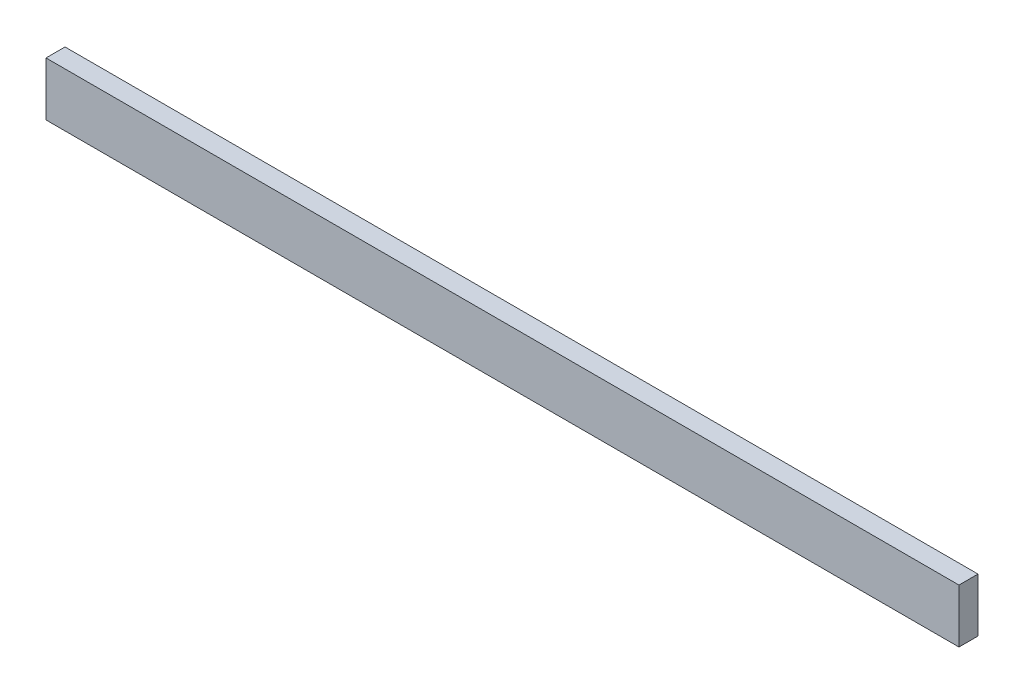
ISO-10303-21;
HEADER;
FILE_DESCRIPTION(('STEP AP214'),'2;1');
FILE_NAME('part.step','',(''),(''),'','','');
FILE_SCHEMA(('AUTOMOTIVE_DESIGN { 1 0 10303 214 1 1 1 1 }'));
ENDSEC;
DATA;
#1=APPLICATION_CONTEXT('core data for automotive mechanical design processes');
#2=APPLICATION_PROTOCOL_DEFINITION('international standard','automotive_design',2000,#1);
#3=PRODUCT_CONTEXT('',#1,'mechanical');
#4=PRODUCT('Part','Part','',(#3));
#5=PRODUCT_RELATED_PRODUCT_CATEGORY('part','',(#4));
#6=PRODUCT_DEFINITION_FORMATION('','',#4);
#7=PRODUCT_DEFINITION_CONTEXT('part definition',#1,'design');
#8=PRODUCT_DEFINITION('design','',#6,#7);
#9=PRODUCT_DEFINITION_SHAPE('','',#8);
#10=(LENGTH_UNIT() NAMED_UNIT(*) SI_UNIT(.MILLI.,.METRE.));
#11=(NAMED_UNIT(*) PLANE_ANGLE_UNIT() SI_UNIT($,.RADIAN.));
#12=(NAMED_UNIT(*) SI_UNIT($,.STERADIAN.) SOLID_ANGLE_UNIT());
#13=UNCERTAINTY_MEASURE_WITH_UNIT(LENGTH_MEASURE(1.E-05),#10,'distance_accuracy_value','');
#14=(GEOMETRIC_REPRESENTATION_CONTEXT(3) GLOBAL_UNCERTAINTY_ASSIGNED_CONTEXT((#13)) GLOBAL_UNIT_ASSIGNED_CONTEXT((#10,
#11,#12)) REPRESENTATION_CONTEXT('',''));
#15=CARTESIAN_POINT('',(0.,0.,0.));
#16=DIRECTION('',(0.,0.,1.));
#17=DIRECTION('',(1.,0.,0.));
#18=AXIS2_PLACEMENT_3D('',#15,#16,#17);
#19=CARTESIAN_POINT('',(0.,12.7,0.));
#20=DIRECTION('',(1.,0.,0.));
#21=DIRECTION('',(0.,0.,-1.));
#22=AXIS2_PLACEMENT_3D('',#19,#20,#21);
#23=PLANE('',#22);
#24=DIRECTION('',(0.,0.,1.));
#25=VECTOR('',#24,1.);
#26=CARTESIAN_POINT('',(0.,0.,0.));
#27=LINE('',#26,#25);
#28=CARTESIAN_POINT('',(0.,0.,-4.5));
#29=VERTEX_POINT('',#28);
#30=CARTESIAN_POINT('',(0.,0.,0.));
#31=VERTEX_POINT('',#30);
#32=EDGE_CURVE('E96',#29,#31,#27,.T.);
#33=ORIENTED_EDGE('',*,*,#32,.T.);
#34=DIRECTION('',(0.,-1.,0.));
#35=VECTOR('',#34,1.);
#36=CARTESIAN_POINT('',(0.,12.7,0.));
#37=LINE('',#36,#35);
#38=CARTESIAN_POINT('',(0.,12.7,0.));
#39=VERTEX_POINT('',#38);
#40=EDGE_CURVE('E11',#39,#31,#37,.T.);
#41=ORIENTED_EDGE('',*,*,#40,.F.);
#42=DIRECTION('',(0.,0.,1.));
#43=VECTOR('',#42,1.);
#44=CARTESIAN_POINT('',(0.,12.7,0.));
#45=LINE('',#44,#43);
#46=CARTESIAN_POINT('',(0.,12.7,-4.5));
#47=VERTEX_POINT('',#46);
#48=EDGE_CURVE('E84',#47,#39,#45,.T.);
#49=ORIENTED_EDGE('',*,*,#48,.F.);
#50=DIRECTION('',(0.,-1.,0.));
#51=VECTOR('',#50,1.);
#52=CARTESIAN_POINT('',(0.,12.7,-4.5));
#53=LINE('',#52,#51);
#54=EDGE_CURVE('E92',#47,#29,#53,.T.);
#55=ORIENTED_EDGE('',*,*,#54,.T.);
#56=EDGE_LOOP('',(#33,#41,#49,#55));
#57=FACE_BOUND('',#56,.T.);
#58=ADVANCED_FACE('F33',(#57),#23,.F.);
#59=CARTESIAN_POINT('',(0.,12.7,0.));
#60=DIRECTION('',(0.,0.,-1.));
#61=DIRECTION('',(-1.,0.,0.));
#62=AXIS2_PLACEMENT_3D('',#59,#60,#61);
#63=PLANE('',#62);
#64=DIRECTION('',(1.,0.,0.));
#65=VECTOR('',#64,1.);
#66=CARTESIAN_POINT('',(0.,0.,0.));
#67=LINE('',#66,#65);
#68=CARTESIAN_POINT('',(215.9,0.,0.));
#69=VERTEX_POINT('',#68);
#70=EDGE_CURVE('E88',#31,#69,#67,.T.);
#71=ORIENTED_EDGE('',*,*,#70,.T.);
#72=DIRECTION('',(0.,-1.,0.));
#73=VECTOR('',#72,1.);
#74=CARTESIAN_POINT('',(215.9,12.7,0.));
#75=LINE('',#74,#73);
#76=CARTESIAN_POINT('',(215.9,12.7,0.));
#77=VERTEX_POINT('',#76);
#78=EDGE_CURVE('E41',#77,#69,#75,.T.);
#79=ORIENTED_EDGE('',*,*,#78,.F.);
#80=DIRECTION('',(1.,0.,0.));
#81=VECTOR('',#80,1.);
#82=CARTESIAN_POINT('',(0.,12.7,0.));
#83=LINE('',#82,#81);
#84=EDGE_CURVE('E79',#39,#77,#83,.T.);
#85=ORIENTED_EDGE('',*,*,#84,.F.);
#86=ORIENTED_EDGE('',*,*,#40,.T.);
#87=EDGE_LOOP('',(#71,#79,#85,#86));
#88=FACE_BOUND('',#87,.T.);
#89=ADVANCED_FACE('F87',(#88),#63,.F.);
#90=CARTESIAN_POINT('',(215.9,12.7,0.));
#91=DIRECTION('',(-1.,0.,0.));
#92=DIRECTION('',(0.,0.,1.));
#93=AXIS2_PLACEMENT_3D('',#90,#91,#92);
#94=PLANE('',#93);
#95=DIRECTION('',(0.,0.,-1.));
#96=VECTOR('',#95,1.);
#97=CARTESIAN_POINT('',(215.9,0.,0.));
#98=LINE('',#97,#96);
#99=CARTESIAN_POINT('',(215.9,0.,-4.5));
#100=VERTEX_POINT('',#99);
#101=EDGE_CURVE('E66',#69,#100,#98,.T.);
#102=ORIENTED_EDGE('',*,*,#101,.T.);
#103=DIRECTION('',(0.,-1.,0.));
#104=VECTOR('',#103,1.);
#105=CARTESIAN_POINT('',(215.9,12.7,-4.5));
#106=LINE('',#105,#104);
#107=CARTESIAN_POINT('',(215.9,12.7,-4.5));
#108=VERTEX_POINT('',#107);
#109=EDGE_CURVE('E89',#108,#100,#106,.T.);
#110=ORIENTED_EDGE('',*,*,#109,.F.);
#111=DIRECTION('',(0.,0.,-1.));
#112=VECTOR('',#111,1.);
#113=CARTESIAN_POINT('',(215.9,12.7,0.));
#114=LINE('',#113,#112);
#115=EDGE_CURVE('E82',#77,#108,#114,.T.);
#116=ORIENTED_EDGE('',*,*,#115,.F.);
#117=ORIENTED_EDGE('',*,*,#78,.T.);
#118=EDGE_LOOP('',(#102,#110,#116,#117));
#119=FACE_BOUND('',#118,.T.);
#120=ADVANCED_FACE('F90',(#119),#94,.F.);
#121=CARTESIAN_POINT('',(0.,12.7,-4.5));
#122=DIRECTION('',(0.,0.,1.));
#123=DIRECTION('',(1.,0.,0.));
#124=AXIS2_PLACEMENT_3D('',#121,#122,#123);
#125=PLANE('',#124);
#126=DIRECTION('',(-1.,0.,0.));
#127=VECTOR('',#126,1.);
#128=CARTESIAN_POINT('',(0.,0.,-4.5));
#129=LINE('',#128,#127);
#130=EDGE_CURVE('E72',#100,#29,#129,.T.);
#131=ORIENTED_EDGE('',*,*,#130,.T.);
#132=ORIENTED_EDGE('',*,*,#54,.F.);
#133=DIRECTION('',(-1.,0.,0.));
#134=VECTOR('',#133,1.);
#135=CARTESIAN_POINT('',(0.,12.7,-4.5));
#136=LINE('',#135,#134);
#137=EDGE_CURVE('E49',#108,#47,#136,.T.);
#138=ORIENTED_EDGE('',*,*,#137,.F.);
#139=ORIENTED_EDGE('',*,*,#109,.T.);
#140=EDGE_LOOP('',(#131,#132,#138,#139));
#141=FACE_BOUND('',#140,.T.);
#142=ADVANCED_FACE('F103',(#141),#125,.F.);
#143=CARTESIAN_POINT('',(0.,12.7,0.));
#144=DIRECTION('',(0.,-1.,0.));
#145=DIRECTION('',(0.,0.,-1.));
#146=AXIS2_PLACEMENT_3D('',#143,#144,#145);
#147=PLANE('',#146);
#148=ORIENTED_EDGE('',*,*,#48,.T.);
#149=ORIENTED_EDGE('',*,*,#84,.T.);
#150=ORIENTED_EDGE('',*,*,#115,.T.);
#151=ORIENTED_EDGE('',*,*,#137,.T.);
#152=EDGE_LOOP('',(#148,#149,#150,#151));
#153=FACE_BOUND('',#152,.T.);
#154=ADVANCED_FACE('F80',(#153),#147,.F.);
#155=CARTESIAN_POINT('',(0.,0.,0.));
#156=DIRECTION('',(0.,-1.,0.));
#157=DIRECTION('',(0.,0.,-1.));
#158=AXIS2_PLACEMENT_3D('',#155,#156,#157);
#159=PLANE('',#158);
#160=ORIENTED_EDGE('',*,*,#32,.F.);
#161=ORIENTED_EDGE('',*,*,#130,.F.);
#162=ORIENTED_EDGE('',*,*,#101,.F.);
#163=ORIENTED_EDGE('',*,*,#70,.F.);
#164=EDGE_LOOP('',(#160,#161,#162,#163));
#165=FACE_BOUND('',#164,.T.);
#166=ADVANCED_FACE('F106',(#165),#159,.T.);
#167=CLOSED_SHELL('',(#58,#89,#120,#142,#154,#166));
#168=MANIFOLD_SOLID_BREP('B2',#167);
#169=ADVANCED_BREP_SHAPE_REPRESENTATION('',(#18,#168),#14);
#170=SHAPE_DEFINITION_REPRESENTATION(#9,#169);
ENDSEC;
END-ISO-10303-21;
